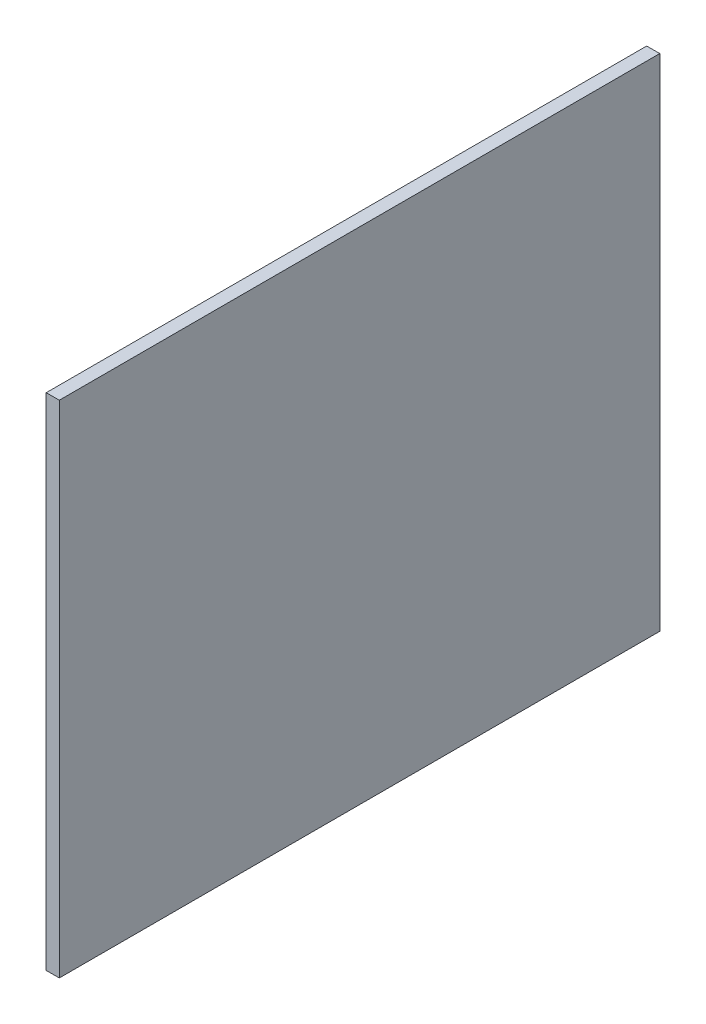
ISO-10303-21;
HEADER;
FILE_DESCRIPTION(('STEP AP214'),'2;1');
FILE_NAME('part.step','',(''),(''),'','','');
FILE_SCHEMA(('AUTOMOTIVE_DESIGN { 1 0 10303 214 1 1 1 1 }'));
ENDSEC;
DATA;
#1=APPLICATION_CONTEXT('core data for automotive mechanical design processes');
#2=APPLICATION_PROTOCOL_DEFINITION('international standard','automotive_design',2000,#1);
#3=PRODUCT_CONTEXT('',#1,'mechanical');
#4=PRODUCT('Part','Part','',(#3));
#5=PRODUCT_RELATED_PRODUCT_CATEGORY('part','',(#4));
#6=PRODUCT_DEFINITION_FORMATION('','',#4);
#7=PRODUCT_DEFINITION_CONTEXT('part definition',#1,'design');
#8=PRODUCT_DEFINITION('design','',#6,#7);
#9=PRODUCT_DEFINITION_SHAPE('','',#8);
#10=(LENGTH_UNIT() NAMED_UNIT(*) SI_UNIT(.MILLI.,.METRE.));
#11=(NAMED_UNIT(*) PLANE_ANGLE_UNIT() SI_UNIT($,.RADIAN.));
#12=(NAMED_UNIT(*) SI_UNIT($,.STERADIAN.) SOLID_ANGLE_UNIT());
#13=UNCERTAINTY_MEASURE_WITH_UNIT(LENGTH_MEASURE(1.E-05),#10,'distance_accuracy_value','');
#14=(GEOMETRIC_REPRESENTATION_CONTEXT(3) GLOBAL_UNCERTAINTY_ASSIGNED_CONTEXT((#13)) GLOBAL_UNIT_ASSIGNED_CONTEXT((#10,
#11,#12)) REPRESENTATION_CONTEXT('',''));
#15=CARTESIAN_POINT('',(0.,0.,0.));
#16=DIRECTION('',(0.,0.,1.));
#17=DIRECTION('',(1.,0.,0.));
#18=AXIS2_PLACEMENT_3D('',#15,#16,#17);
#19=CARTESIAN_POINT('',(6.,0.,0.));
#20=DIRECTION('',(0.,0.,-1.));
#21=DIRECTION('',(-1.,0.,0.));
#22=AXIS2_PLACEMENT_3D('',#19,#20,#21);
#23=PLANE('',#22);
#24=DIRECTION('',(0.,-1.,0.));
#25=VECTOR('',#24,1.);
#26=CARTESIAN_POINT('',(0.,0.,0.));
#27=LINE('',#26,#25);
#28=CARTESIAN_POINT('',(0.,230.,0.));
#29=VERTEX_POINT('',#28);
#30=CARTESIAN_POINT('',(0.,0.,0.));
#31=VERTEX_POINT('',#30);
#32=EDGE_CURVE('E97',#29,#31,#27,.T.);
#33=ORIENTED_EDGE('',*,*,#32,.T.);
#34=DIRECTION('',(-1.,0.,0.));
#35=VECTOR('',#34,1.);
#36=CARTESIAN_POINT('',(6.,0.,0.));
#37=LINE('',#36,#35);
#38=CARTESIAN_POINT('',(6.,0.,0.));
#39=VERTEX_POINT('',#38);
#40=EDGE_CURVE('E11',#39,#31,#37,.T.);
#41=ORIENTED_EDGE('',*,*,#40,.F.);
#42=DIRECTION('',(0.,-1.,0.));
#43=VECTOR('',#42,1.);
#44=CARTESIAN_POINT('',(6.,0.,0.));
#45=LINE('',#44,#43);
#46=CARTESIAN_POINT('',(6.,230.,0.));
#47=VERTEX_POINT('',#46);
#48=EDGE_CURVE('E85',#47,#39,#45,.T.);
#49=ORIENTED_EDGE('',*,*,#48,.F.);
#50=DIRECTION('',(-1.,0.,0.));
#51=VECTOR('',#50,1.);
#52=CARTESIAN_POINT('',(6.,230.,0.));
#53=LINE('',#52,#51);
#54=EDGE_CURVE('E93',#47,#29,#53,.T.);
#55=ORIENTED_EDGE('',*,*,#54,.T.);
#56=EDGE_LOOP('',(#33,#41,#49,#55));
#57=FACE_BOUND('',#56,.T.);
#58=ADVANCED_FACE('F34',(#57),#23,.F.);
#59=CARTESIAN_POINT('',(6.,0.,0.));
#60=DIRECTION('',(0.,1.,0.));
#61=DIRECTION('',(0.,0.,1.));
#62=AXIS2_PLACEMENT_3D('',#59,#60,#61);
#63=PLANE('',#62);
#64=DIRECTION('',(0.,0.,-1.));
#65=VECTOR('',#64,1.);
#66=CARTESIAN_POINT('',(0.,0.,0.));
#67=LINE('',#66,#65);
#68=CARTESIAN_POINT('',(0.,0.,-276.));
#69=VERTEX_POINT('',#68);
#70=EDGE_CURVE('E89',#31,#69,#67,.T.);
#71=ORIENTED_EDGE('',*,*,#70,.T.);
#72=DIRECTION('',(-1.,0.,0.));
#73=VECTOR('',#72,1.);
#74=CARTESIAN_POINT('',(6.,0.,-276.));
#75=LINE('',#74,#73);
#76=CARTESIAN_POINT('',(6.,0.,-276.));
#77=VERTEX_POINT('',#76);
#78=EDGE_CURVE('E42',#77,#69,#75,.T.);
#79=ORIENTED_EDGE('',*,*,#78,.F.);
#80=DIRECTION('',(0.,0.,-1.));
#81=VECTOR('',#80,1.);
#82=CARTESIAN_POINT('',(6.,0.,0.));
#83=LINE('',#82,#81);
#84=EDGE_CURVE('E80',#39,#77,#83,.T.);
#85=ORIENTED_EDGE('',*,*,#84,.F.);
#86=ORIENTED_EDGE('',*,*,#40,.T.);
#87=EDGE_LOOP('',(#71,#79,#85,#86));
#88=FACE_BOUND('',#87,.T.);
#89=ADVANCED_FACE('F88',(#88),#63,.F.);
#90=CARTESIAN_POINT('',(6.,0.,-276.));
#91=DIRECTION('',(0.,0.,1.));
#92=DIRECTION('',(1.,0.,0.));
#93=AXIS2_PLACEMENT_3D('',#90,#91,#92);
#94=PLANE('',#93);
#95=DIRECTION('',(0.,1.,0.));
#96=VECTOR('',#95,1.);
#97=CARTESIAN_POINT('',(0.,0.,-276.));
#98=LINE('',#97,#96);
#99=CARTESIAN_POINT('',(0.,230.,-276.));
#100=VERTEX_POINT('',#99);
#101=EDGE_CURVE('E67',#69,#100,#98,.T.);
#102=ORIENTED_EDGE('',*,*,#101,.T.);
#103=DIRECTION('',(-1.,0.,0.));
#104=VECTOR('',#103,1.);
#105=CARTESIAN_POINT('',(6.,230.,-276.));
#106=LINE('',#105,#104);
#107=CARTESIAN_POINT('',(6.,230.,-276.));
#108=VERTEX_POINT('',#107);
#109=EDGE_CURVE('E90',#108,#100,#106,.T.);
#110=ORIENTED_EDGE('',*,*,#109,.F.);
#111=DIRECTION('',(0.,1.,0.));
#112=VECTOR('',#111,1.);
#113=CARTESIAN_POINT('',(6.,0.,-276.));
#114=LINE('',#113,#112);
#115=EDGE_CURVE('E83',#77,#108,#114,.T.);
#116=ORIENTED_EDGE('',*,*,#115,.F.);
#117=ORIENTED_EDGE('',*,*,#78,.T.);
#118=EDGE_LOOP('',(#102,#110,#116,#117));
#119=FACE_BOUND('',#118,.T.);
#120=ADVANCED_FACE('F91',(#119),#94,.F.);
#121=CARTESIAN_POINT('',(6.,230.,0.));
#122=DIRECTION('',(0.,-1.,0.));
#123=DIRECTION('',(0.,0.,-1.));
#124=AXIS2_PLACEMENT_3D('',#121,#122,#123);
#125=PLANE('',#124);
#126=DIRECTION('',(0.,0.,1.));
#127=VECTOR('',#126,1.);
#128=CARTESIAN_POINT('',(0.,230.,0.));
#129=LINE('',#128,#127);
#130=EDGE_CURVE('E73',#100,#29,#129,.T.);
#131=ORIENTED_EDGE('',*,*,#130,.T.);
#132=ORIENTED_EDGE('',*,*,#54,.F.);
#133=DIRECTION('',(0.,0.,1.));
#134=VECTOR('',#133,1.);
#135=CARTESIAN_POINT('',(6.,230.,0.));
#136=LINE('',#135,#134);
#137=EDGE_CURVE('E50',#108,#47,#136,.T.);
#138=ORIENTED_EDGE('',*,*,#137,.F.);
#139=ORIENTED_EDGE('',*,*,#109,.T.);
#140=EDGE_LOOP('',(#131,#132,#138,#139));
#141=FACE_BOUND('',#140,.T.);
#142=ADVANCED_FACE('F104',(#141),#125,.F.);
#143=CARTESIAN_POINT('',(6.,0.,0.));
#144=DIRECTION('',(-1.,0.,0.));
#145=DIRECTION('',(0.,0.,1.));
#146=AXIS2_PLACEMENT_3D('',#143,#144,#145);
#147=PLANE('',#146);
#148=ORIENTED_EDGE('',*,*,#48,.T.);
#149=ORIENTED_EDGE('',*,*,#84,.T.);
#150=ORIENTED_EDGE('',*,*,#115,.T.);
#151=ORIENTED_EDGE('',*,*,#137,.T.);
#152=EDGE_LOOP('',(#148,#149,#150,#151));
#153=FACE_BOUND('',#152,.T.);
#154=ADVANCED_FACE('F81',(#153),#147,.F.);
#155=CARTESIAN_POINT('',(0.,0.,0.));
#156=DIRECTION('',(-1.,0.,0.));
#157=DIRECTION('',(0.,0.,1.));
#158=AXIS2_PLACEMENT_3D('',#155,#156,#157);
#159=PLANE('',#158);
#160=ORIENTED_EDGE('',*,*,#32,.F.);
#161=ORIENTED_EDGE('',*,*,#130,.F.);
#162=ORIENTED_EDGE('',*,*,#101,.F.);
#163=ORIENTED_EDGE('',*,*,#70,.F.);
#164=EDGE_LOOP('',(#160,#161,#162,#163));
#165=FACE_BOUND('',#164,.T.);
#166=ADVANCED_FACE('F107',(#165),#159,.T.);
#167=CLOSED_SHELL('',(#58,#89,#120,#142,#154,#166));
#168=MANIFOLD_SOLID_BREP('B2',#167);
#169=ADVANCED_BREP_SHAPE_REPRESENTATION('',(#18,#168),#14);
#170=SHAPE_DEFINITION_REPRESENTATION(#9,#169);
ENDSEC;
END-ISO-10303-21;
